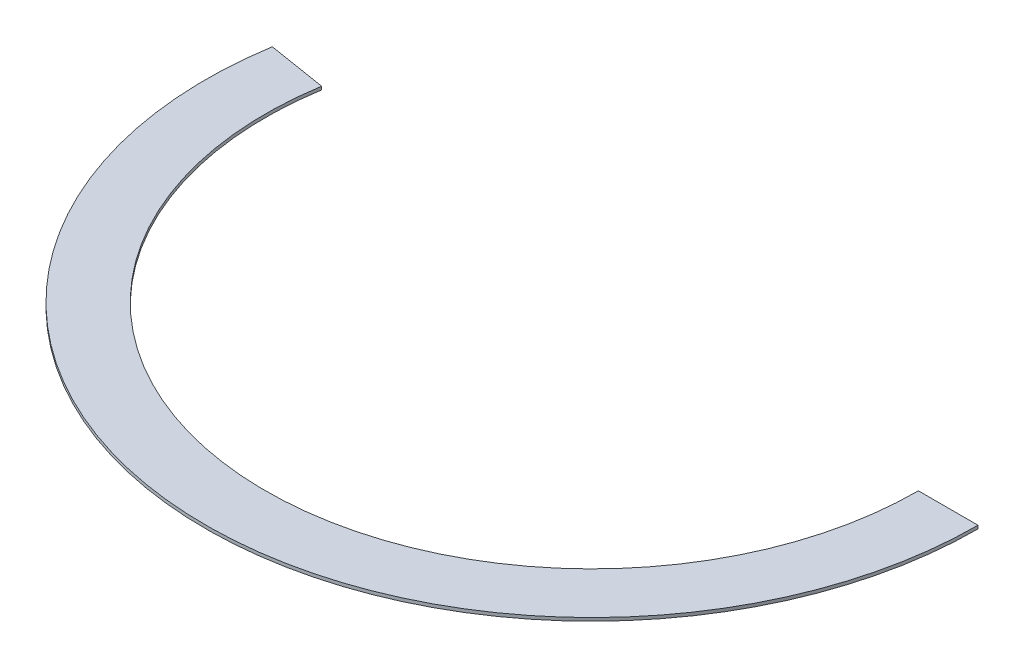
ISO-10303-21;
HEADER;
FILE_DESCRIPTION(('STEP AP214'),'2;1');
FILE_NAME('part.step','',(''),(''),'','','');
FILE_SCHEMA(('AUTOMOTIVE_DESIGN { 1 0 10303 214 1 1 1 1 }'));
ENDSEC;
DATA;
#1=APPLICATION_CONTEXT('core data for automotive mechanical design processes');
#2=APPLICATION_PROTOCOL_DEFINITION('international standard','automotive_design',2000,#1);
#3=PRODUCT_CONTEXT('',#1,'mechanical');
#4=PRODUCT('Part','Part','',(#3));
#5=PRODUCT_RELATED_PRODUCT_CATEGORY('part','',(#4));
#6=PRODUCT_DEFINITION_FORMATION('','',#4);
#7=PRODUCT_DEFINITION_CONTEXT('part definition',#1,'design');
#8=PRODUCT_DEFINITION('design','',#6,#7);
#9=PRODUCT_DEFINITION_SHAPE('','',#8);
#10=(LENGTH_UNIT() NAMED_UNIT(*) SI_UNIT(.MILLI.,.METRE.));
#11=(NAMED_UNIT(*) PLANE_ANGLE_UNIT() SI_UNIT($,.RADIAN.));
#12=(NAMED_UNIT(*) SI_UNIT($,.STERADIAN.) SOLID_ANGLE_UNIT());
#13=UNCERTAINTY_MEASURE_WITH_UNIT(LENGTH_MEASURE(1.E-05),#10,'distance_accuracy_value','');
#14=(GEOMETRIC_REPRESENTATION_CONTEXT(3) GLOBAL_UNCERTAINTY_ASSIGNED_CONTEXT((#13)) GLOBAL_UNIT_ASSIGNED_CONTEXT((#10,
#11,#12)) REPRESENTATION_CONTEXT('',''));
#15=CARTESIAN_POINT('',(0.,0.,0.));
#16=DIRECTION('',(0.,0.,1.));
#17=DIRECTION('',(1.,0.,0.));
#18=AXIS2_PLACEMENT_3D('',#15,#16,#17);
#19=CARTESIAN_POINT('',(0.,0.7,0.));
#20=DIRECTION('',(0.,-1.,0.));
#21=DIRECTION('',(0.,0.,-1.));
#22=AXIS2_PLACEMENT_3D('',#19,#20,#21);
#23=CYLINDRICAL_SURFACE('',#22,84.22);
#24=CARTESIAN_POINT('',(0.,0.,0.));
#25=DIRECTION('',(0.,1.,0.));
#26=DIRECTION('',(0.,0.,1.));
#27=AXIS2_PLACEMENT_3D('',#24,#25,#26);
#28=CIRCLE('',#27,84.22);
#29=CARTESIAN_POINT('',(-83.1436552068341,0.,-13.4216615531422));
#30=VERTEX_POINT('',#29);
#31=CARTESIAN_POINT('',(84.22,0.,0.));
#32=VERTEX_POINT('',#31);
#33=EDGE_CURVE('E96',#30,#32,#28,.T.);
#34=ORIENTED_EDGE('',*,*,#33,.T.);
#35=DIRECTION('',(0.,-1.,0.));
#36=VECTOR('',#35,1.);
#37=CARTESIAN_POINT('',(84.22,0.7,0.));
#38=LINE('',#37,#36);
#39=CARTESIAN_POINT('',(84.22,0.7,0.));
#40=VERTEX_POINT('',#39);
#41=EDGE_CURVE('E11',#40,#32,#38,.T.);
#42=ORIENTED_EDGE('',*,*,#41,.F.);
#43=CARTESIAN_POINT('',(0.,0.7,0.));
#44=DIRECTION('',(0.,1.,0.));
#45=DIRECTION('',(0.,0.,1.));
#46=AXIS2_PLACEMENT_3D('',#43,#44,#45);
#47=CIRCLE('',#46,84.22);
#48=CARTESIAN_POINT('',(-83.1436552068341,0.7,-13.4216615531422));
#49=VERTEX_POINT('',#48);
#50=EDGE_CURVE('E84',#49,#40,#47,.T.);
#51=ORIENTED_EDGE('',*,*,#50,.F.);
#52=DIRECTION('',(0.,-1.,0.));
#53=VECTOR('',#52,1.);
#54=CARTESIAN_POINT('',(-83.1436552068341,0.7,-13.4216615531422));
#55=LINE('',#54,#53);
#56=EDGE_CURVE('E92',#49,#30,#55,.T.);
#57=ORIENTED_EDGE('',*,*,#56,.T.);
#58=EDGE_LOOP('',(#34,#42,#51,#57));
#59=FACE_BOUND('',#58,.T.);
#60=ADVANCED_FACE('F33',(#59),#23,.T.);
#61=CARTESIAN_POINT('',(71.22,0.7,0.));
#62=DIRECTION('',(0.,0.,1.));
#63=DIRECTION('',(1.,0.,0.));
#64=AXIS2_PLACEMENT_3D('',#61,#62,#63);
#65=PLANE('',#64);
#66=DIRECTION('',(-1.,0.,0.));
#67=VECTOR('',#66,1.);
#68=CARTESIAN_POINT('',(71.22,0.,0.));
#69=LINE('',#68,#67);
#70=CARTESIAN_POINT('',(71.22,0.,0.));
#71=VERTEX_POINT('',#70);
#72=EDGE_CURVE('E88',#32,#71,#69,.T.);
#73=ORIENTED_EDGE('',*,*,#72,.T.);
#74=DIRECTION('',(0.,-1.,0.));
#75=VECTOR('',#74,1.);
#76=CARTESIAN_POINT('',(71.22,0.7,0.));
#77=LINE('',#76,#75);
#78=CARTESIAN_POINT('',(71.22,0.7,0.));
#79=VERTEX_POINT('',#78);
#80=EDGE_CURVE('E41',#79,#71,#77,.T.);
#81=ORIENTED_EDGE('',*,*,#80,.F.);
#82=DIRECTION('',(-1.,0.,0.));
#83=VECTOR('',#82,1.);
#84=CARTESIAN_POINT('',(71.22,0.7,0.));
#85=LINE('',#84,#83);
#86=EDGE_CURVE('E79',#40,#79,#85,.T.);
#87=ORIENTED_EDGE('',*,*,#86,.F.);
#88=ORIENTED_EDGE('',*,*,#41,.T.);
#89=EDGE_LOOP('',(#73,#81,#87,#88));
#90=FACE_BOUND('',#89,.T.);
#91=ADVANCED_FACE('F87',(#90),#65,.F.);
#92=CARTESIAN_POINT('',(0.,0.7,0.));
#93=DIRECTION('',(0.,-1.,0.));
#94=DIRECTION('',(0.,0.,-1.));
#95=AXIS2_PLACEMENT_3D('',#92,#93,#94);
#96=CYLINDRICAL_SURFACE('',#95,71.22);
#97=CARTESIAN_POINT('',(0.,0.,0.));
#98=DIRECTION('',(0.,-1.,0.));
#99=DIRECTION('',(0.,0.,-1.));
#100=AXIS2_PLACEMENT_3D('',#97,#98,#99);
#101=CIRCLE('',#100,71.22);
#102=CARTESIAN_POINT('',(-70.3097972433,0.,-11.3499256211682));
#103=VERTEX_POINT('',#102);
#104=EDGE_CURVE('E66',#71,#103,#101,.T.);
#105=ORIENTED_EDGE('',*,*,#104,.T.);
#106=DIRECTION('',(0.,-1.,0.));
#107=VECTOR('',#106,1.);
#108=CARTESIAN_POINT('',(-70.3097972433,0.7,-11.3499256211682));
#109=LINE('',#108,#107);
#110=CARTESIAN_POINT('',(-70.3097972433,0.7,-11.3499256211682));
#111=VERTEX_POINT('',#110);
#112=EDGE_CURVE('E89',#111,#103,#109,.T.);
#113=ORIENTED_EDGE('',*,*,#112,.F.);
#114=CARTESIAN_POINT('',(0.,0.7,0.));
#115=DIRECTION('',(0.,-1.,0.));
#116=DIRECTION('',(0.,0.,-1.));
#117=AXIS2_PLACEMENT_3D('',#114,#115,#116);
#118=CIRCLE('',#117,71.22);
#119=EDGE_CURVE('E82',#79,#111,#118,.T.);
#120=ORIENTED_EDGE('',*,*,#119,.F.);
#121=ORIENTED_EDGE('',*,*,#80,.T.);
#122=EDGE_LOOP('',(#105,#113,#120,#121));
#123=FACE_BOUND('',#122,.T.);
#124=ADVANCED_FACE('F90',(#123),#96,.F.);
#125=CARTESIAN_POINT('',(-70.3097972433,0.7,-11.3499256211682));
#126=DIRECTION('',(-0.159364302459537,0.,0.987219843348778));
#127=DIRECTION('',(0.987219843348778,0.,0.159364302459537));
#128=AXIS2_PLACEMENT_3D('',#125,#126,#127);
#129=PLANE('',#128);
#130=DIRECTION('',(-0.987219843348778,0.,-0.159364302459537));
#131=VECTOR('',#130,1.);
#132=CARTESIAN_POINT('',(-70.3097972433,0.,-11.3499256211682));
#133=LINE('',#132,#131);
#134=EDGE_CURVE('E72',#103,#30,#133,.T.);
#135=ORIENTED_EDGE('',*,*,#134,.T.);
#136=ORIENTED_EDGE('',*,*,#56,.F.);
#137=DIRECTION('',(-0.987219843348778,0.,-0.159364302459537));
#138=VECTOR('',#137,1.);
#139=CARTESIAN_POINT('',(-70.3097972433,0.7,-11.3499256211682));
#140=LINE('',#139,#138);
#141=EDGE_CURVE('E49',#111,#49,#140,.T.);
#142=ORIENTED_EDGE('',*,*,#141,.F.);
#143=ORIENTED_EDGE('',*,*,#112,.T.);
#144=EDGE_LOOP('',(#135,#136,#142,#143));
#145=FACE_BOUND('',#144,.T.);
#146=ADVANCED_FACE('F103',(#145),#129,.F.);
#147=CARTESIAN_POINT('',(0.,0.7,0.));
#148=DIRECTION('',(0.,1.,0.));
#149=DIRECTION('',(0.,0.,1.));
#150=AXIS2_PLACEMENT_3D('',#147,#148,#149);
#151=PLANE('',#150);
#152=ORIENTED_EDGE('',*,*,#50,.T.);
#153=ORIENTED_EDGE('',*,*,#86,.T.);
#154=ORIENTED_EDGE('',*,*,#119,.T.);
#155=ORIENTED_EDGE('',*,*,#141,.T.);
#156=EDGE_LOOP('',(#152,#153,#154,#155));
#157=FACE_BOUND('',#156,.T.);
#158=ADVANCED_FACE('F80',(#157),#151,.T.);
#159=CARTESIAN_POINT('',(0.,0.,0.));
#160=DIRECTION('',(0.,1.,0.));
#161=DIRECTION('',(0.,0.,1.));
#162=AXIS2_PLACEMENT_3D('',#159,#160,#161);
#163=PLANE('',#162);
#164=ORIENTED_EDGE('',*,*,#33,.F.);
#165=ORIENTED_EDGE('',*,*,#134,.F.);
#166=ORIENTED_EDGE('',*,*,#104,.F.);
#167=ORIENTED_EDGE('',*,*,#72,.F.);
#168=EDGE_LOOP('',(#164,#165,#166,#167));
#169=FACE_BOUND('',#168,.T.);
#170=ADVANCED_FACE('F106',(#169),#163,.F.);
#171=CLOSED_SHELL('',(#60,#91,#124,#146,#158,#170));
#172=MANIFOLD_SOLID_BREP('B2',#171);
#173=ADVANCED_BREP_SHAPE_REPRESENTATION('',(#18,#172),#14);
#174=SHAPE_DEFINITION_REPRESENTATION(#9,#173);
ENDSEC;
END-ISO-10303-21;
